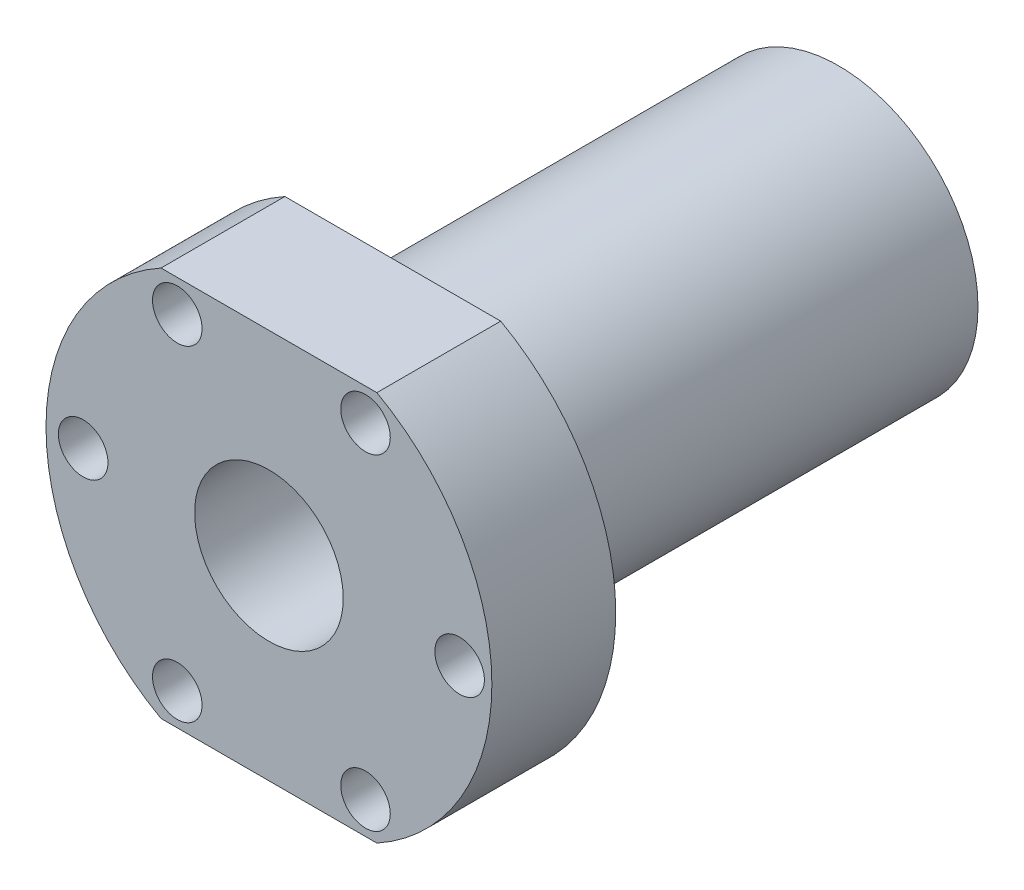
ISO-10303-21;
HEADER;
FILE_DESCRIPTION(('STEP AP214'),'2;1');
FILE_NAME('part.step','',(''),(''),'','','');
FILE_SCHEMA(('AUTOMOTIVE_DESIGN { 1 0 10303 214 1 1 1 1 }'));
ENDSEC;
DATA;
#1=APPLICATION_CONTEXT('core data for automotive mechanical design processes');
#2=APPLICATION_PROTOCOL_DEFINITION('international standard','automotive_design',2000,#1);
#3=PRODUCT_CONTEXT('',#1,'mechanical');
#4=PRODUCT('Part','Part','',(#3));
#5=PRODUCT_RELATED_PRODUCT_CATEGORY('part','',(#4));
#6=PRODUCT_DEFINITION_FORMATION('','',#4);
#7=PRODUCT_DEFINITION_CONTEXT('part definition',#1,'design');
#8=PRODUCT_DEFINITION('design','',#6,#7);
#9=PRODUCT_DEFINITION_SHAPE('','',#8);
#10=(LENGTH_UNIT() NAMED_UNIT(*) SI_UNIT(.MILLI.,.METRE.));
#11=(NAMED_UNIT(*) PLANE_ANGLE_UNIT() SI_UNIT($,.RADIAN.));
#12=(NAMED_UNIT(*) SI_UNIT($,.STERADIAN.) SOLID_ANGLE_UNIT());
#13=UNCERTAINTY_MEASURE_WITH_UNIT(LENGTH_MEASURE(1.E-05),#10,'distance_accuracy_value','');
#14=(GEOMETRIC_REPRESENTATION_CONTEXT(3) GLOBAL_UNCERTAINTY_ASSIGNED_CONTEXT((#13)) GLOBAL_UNIT_ASSIGNED_CONTEXT((#10,
#11,#12)) REPRESENTATION_CONTEXT('',''));
#15=CARTESIAN_POINT('',(0.,0.,0.));
#16=DIRECTION('',(0.,0.,1.));
#17=DIRECTION('',(1.,0.,0.));
#18=AXIS2_PLACEMENT_3D('',#15,#16,#17);
#19=CARTESIAN_POINT('',(0.,0.,10.));
#20=DIRECTION('',(0.,0.,-1.));
#21=DIRECTION('',(-1.,0.,0.));
#22=AXIS2_PLACEMENT_3D('',#19,#20,#21);
#23=CYLINDRICAL_SURFACE('',#22,18.);
#24=CARTESIAN_POINT('',(0.,0.,0.));
#25=DIRECTION('',(0.,0.,1.));
#26=DIRECTION('',(1.,0.,0.));
#27=AXIS2_PLACEMENT_3D('',#24,#25,#26);
#28=CIRCLE('',#27,18.);
#29=CARTESIAN_POINT('',(-8.71421252896669,15.75,0.));
#30=VERTEX_POINT('',#29);
#31=CARTESIAN_POINT('',(-8.71421252896668,-15.75,0.));
#32=VERTEX_POINT('',#31);
#33=EDGE_CURVE('E115',#30,#32,#28,.T.);
#34=ORIENTED_EDGE('',*,*,#33,.T.);
#35=DIRECTION('',(0.,0.,-1.));
#36=VECTOR('',#35,1.);
#37=CARTESIAN_POINT('',(-8.71421252896668,-15.75,10.));
#38=LINE('',#37,#36);
#39=CARTESIAN_POINT('',(-8.71421252896668,-15.75,10.));
#40=VERTEX_POINT('',#39);
#41=EDGE_CURVE('E53',#40,#32,#38,.T.);
#42=ORIENTED_EDGE('',*,*,#41,.F.);
#43=CARTESIAN_POINT('',(0.,0.,10.));
#44=DIRECTION('',(0.,0.,1.));
#45=DIRECTION('',(1.,0.,0.));
#46=AXIS2_PLACEMENT_3D('',#43,#44,#45);
#47=CIRCLE('',#46,18.);
#48=CARTESIAN_POINT('',(-8.71421252896669,15.75,10.));
#49=VERTEX_POINT('',#48);
#50=EDGE_CURVE('E97',#49,#40,#47,.T.);
#51=ORIENTED_EDGE('',*,*,#50,.F.);
#52=DIRECTION('',(0.,0.,-1.));
#53=VECTOR('',#52,1.);
#54=CARTESIAN_POINT('',(-8.71421252896669,15.75,10.));
#55=LINE('',#54,#53);
#56=EDGE_CURVE('E111',#49,#30,#55,.T.);
#57=ORIENTED_EDGE('',*,*,#56,.T.);
#58=EDGE_LOOP('',(#34,#42,#51,#57));
#59=FACE_BOUND('',#58,.T.);
#60=ADVANCED_FACE('F43',(#59),#23,.T.);
#61=CARTESIAN_POINT('',(-8.71421252896668,-15.75,10.));
#62=DIRECTION('',(0.,1.,0.));
#63=DIRECTION('',(0.,0.,1.));
#64=AXIS2_PLACEMENT_3D('',#61,#62,#63);
#65=PLANE('',#64);
#66=DIRECTION('',(1.,0.,0.));
#67=VECTOR('',#66,1.);
#68=CARTESIAN_POINT('',(-8.71421252896668,-15.75,0.));
#69=LINE('',#68,#67);
#70=CARTESIAN_POINT('',(8.71421252896668,-15.75,0.));
#71=VERTEX_POINT('',#70);
#72=EDGE_CURVE('E103',#32,#71,#69,.T.);
#73=ORIENTED_EDGE('',*,*,#72,.T.);
#74=DIRECTION('',(0.,0.,-1.));
#75=VECTOR('',#74,1.);
#76=CARTESIAN_POINT('',(8.71421252896668,-15.75,10.));
#77=LINE('',#76,#75);
#78=CARTESIAN_POINT('',(8.71421252896668,-15.75,10.));
#79=VERTEX_POINT('',#78);
#80=EDGE_CURVE('E101',#79,#71,#77,.T.);
#81=ORIENTED_EDGE('',*,*,#80,.F.);
#82=DIRECTION('',(1.,0.,0.));
#83=VECTOR('',#82,1.);
#84=CARTESIAN_POINT('',(-8.71421252896668,-15.75,10.));
#85=LINE('',#84,#83);
#86=EDGE_CURVE('E92',#40,#79,#85,.T.);
#87=ORIENTED_EDGE('',*,*,#86,.F.);
#88=ORIENTED_EDGE('',*,*,#41,.T.);
#89=EDGE_LOOP('',(#73,#81,#87,#88));
#90=FACE_BOUND('',#89,.T.);
#91=ADVANCED_FACE('F102',(#90),#65,.F.);
#92=CARTESIAN_POINT('',(0.,0.,10.));
#93=DIRECTION('',(0.,0.,-1.));
#94=DIRECTION('',(-1.,0.,0.));
#95=AXIS2_PLACEMENT_3D('',#92,#93,#94);
#96=CYLINDRICAL_SURFACE('',#95,18.);
#97=CARTESIAN_POINT('',(0.,0.,0.));
#98=DIRECTION('',(0.,0.,1.));
#99=DIRECTION('',(1.,0.,0.));
#100=AXIS2_PLACEMENT_3D('',#97,#98,#99);
#101=CIRCLE('',#100,18.);
#102=CARTESIAN_POINT('',(8.7142125289667,15.75,0.));
#103=VERTEX_POINT('',#102);
#104=EDGE_CURVE('E78',#71,#103,#101,.T.);
#105=ORIENTED_EDGE('',*,*,#104,.T.);
#106=DIRECTION('',(0.,0.,-1.));
#107=VECTOR('',#106,1.);
#108=CARTESIAN_POINT('',(8.7142125289667,15.75,10.));
#109=LINE('',#108,#107);
#110=CARTESIAN_POINT('',(8.7142125289667,15.75,10.));
#111=VERTEX_POINT('',#110);
#112=EDGE_CURVE('E105',#111,#103,#109,.T.);
#113=ORIENTED_EDGE('',*,*,#112,.F.);
#114=CARTESIAN_POINT('',(0.,0.,10.));
#115=DIRECTION('',(0.,0.,1.));
#116=DIRECTION('',(1.,0.,0.));
#117=AXIS2_PLACEMENT_3D('',#114,#115,#116);
#118=CIRCLE('',#117,18.);
#119=EDGE_CURVE('E95',#79,#111,#118,.T.);
#120=ORIENTED_EDGE('',*,*,#119,.F.);
#121=ORIENTED_EDGE('',*,*,#80,.T.);
#122=EDGE_LOOP('',(#105,#113,#120,#121));
#123=FACE_BOUND('',#122,.T.);
#124=ADVANCED_FACE('F107',(#123),#96,.T.);
#125=CARTESIAN_POINT('',(8.71421252896669,15.75,10.));
#126=DIRECTION('',(0.,-1.,0.));
#127=DIRECTION('',(0.,0.,-1.));
#128=AXIS2_PLACEMENT_3D('',#125,#126,#127);
#129=PLANE('',#128);
#130=DIRECTION('',(-1.,0.,0.));
#131=VECTOR('',#130,1.);
#132=CARTESIAN_POINT('',(8.71421252896669,15.75,0.));
#133=LINE('',#132,#131);
#134=EDGE_CURVE('E84',#103,#30,#133,.T.);
#135=ORIENTED_EDGE('',*,*,#134,.T.);
#136=ORIENTED_EDGE('',*,*,#56,.F.);
#137=DIRECTION('',(-1.,0.,0.));
#138=VECTOR('',#137,1.);
#139=CARTESIAN_POINT('',(8.71421252896669,15.75,10.));
#140=LINE('',#139,#138);
#141=EDGE_CURVE('E61',#111,#49,#140,.T.);
#142=ORIENTED_EDGE('',*,*,#141,.F.);
#143=ORIENTED_EDGE('',*,*,#112,.T.);
#144=EDGE_LOOP('',(#135,#136,#142,#143));
#145=FACE_BOUND('',#144,.T.);
#146=ADVANCED_FACE('F229',(#145),#129,.F.);
#147=CARTESIAN_POINT('',(0.,0.,10.));
#148=DIRECTION('',(0.,0.,1.));
#149=DIRECTION('',(1.,0.,0.));
#150=AXIS2_PLACEMENT_3D('',#147,#148,#149);
#151=PLANE('',#150);
#152=CARTESIAN_POINT('',(0.,0.,10.));
#153=DIRECTION('',(0.,0.,1.));
#154=DIRECTION('',(1.,0.,0.));
#155=AXIS2_PLACEMENT_3D('',#152,#153,#154);
#156=CIRCLE('',#155,6.);
#157=CARTESIAN_POINT('',(6.,0.,10.));
#158=VERTEX_POINT('',#157);
#159=EDGE_CURVE('E188',#158,#158,#156,.T.);
#160=ORIENTED_EDGE('',*,*,#159,.F.);
#161=EDGE_LOOP('',(#160));
#162=FACE_BOUND('',#161,.T.);
#163=CARTESIAN_POINT('',(-7.40103492470428,13.1617935953538,10.));
#164=DIRECTION('',(0.,0.,1.));
#165=DIRECTION('',(0.50000000000001,-0.866025403784433,0.));
#166=AXIS2_PLACEMENT_3D('',#163,#164,#165);
#167=CIRCLE('',#166,2.);
#168=CARTESIAN_POINT('',(-6.40103492470426,11.4297427877849,10.));
#169=VERTEX_POINT('',#168);
#170=EDGE_CURVE('E169',#169,#169,#167,.T.);
#171=ORIENTED_EDGE('',*,*,#170,.F.);
#172=EDGE_LOOP('',(#171));
#173=FACE_BOUND('',#172,.T.);
#174=CARTESIAN_POINT('',(7.79689522588749,13.161793595354,10.));
#175=DIRECTION('',(0.,0.,1.));
#176=DIRECTION('',(-0.499999999999992,-0.866025403784443,0.));
#177=AXIS2_PLACEMENT_3D('',#174,#175,#176);
#178=CIRCLE('',#177,2.);
#179=CARTESIAN_POINT('',(6.7968952258875,11.4297427877851,10.));
#180=VERTEX_POINT('',#179);
#181=EDGE_CURVE('E173',#180,#180,#178,.T.);
#182=ORIENTED_EDGE('',*,*,#181,.F.);
#183=EDGE_LOOP('',(#182));
#184=FACE_BOUND('',#183,.T.);
#185=CARTESIAN_POINT('',(15.3958603011835,0.,10.));
#186=DIRECTION('',(0.,0.,1.));
#187=DIRECTION('',(-1.,0.,0.));
#188=AXIS2_PLACEMENT_3D('',#185,#186,#187);
#189=CIRCLE('',#188,2.);
#190=CARTESIAN_POINT('',(13.3958603011835,0.,10.));
#191=VERTEX_POINT('',#190);
#192=EDGE_CURVE('E178',#191,#191,#189,.T.);
#193=ORIENTED_EDGE('',*,*,#192,.F.);
#194=EDGE_LOOP('',(#193));
#195=FACE_BOUND('',#194,.T.);
#196=CARTESIAN_POINT('',(7.79689522588767,-13.1617935953539,10.));
#197=DIRECTION('',(0.,0.,1.));
#198=DIRECTION('',(-0.500000000000004,0.866025403784436,0.));
#199=AXIS2_PLACEMENT_3D('',#196,#197,#198);
#200=CIRCLE('',#199,2.);
#201=CARTESIAN_POINT('',(6.79689522588766,-11.429742787785,10.));
#202=VERTEX_POINT('',#201);
#203=EDGE_CURVE('E168',#202,#202,#200,.T.);
#204=ORIENTED_EDGE('',*,*,#203,.F.);
#205=EDGE_LOOP('',(#204));
#206=FACE_BOUND('',#205,.T.);
#207=CARTESIAN_POINT('',(-7.4010349247041,-13.1617935953539,10.));
#208=DIRECTION('',(0.,0.,1.));
#209=DIRECTION('',(0.499999999999998,0.86602540378444,0.));
#210=AXIS2_PLACEMENT_3D('',#207,#208,#209);
#211=CIRCLE('',#210,2.);
#212=CARTESIAN_POINT('',(-6.40103492470411,-11.429742787785,10.));
#213=VERTEX_POINT('',#212);
#214=EDGE_CURVE('E141',#213,#213,#211,.T.);
#215=ORIENTED_EDGE('',*,*,#214,.F.);
#216=EDGE_LOOP('',(#215));
#217=FACE_BOUND('',#216,.T.);
#218=CARTESIAN_POINT('',(-15.,0.,10.));
#219=DIRECTION('',(0.,0.,1.));
#220=DIRECTION('',(1.,0.,0.));
#221=AXIS2_PLACEMENT_3D('',#218,#219,#220);
#222=CIRCLE('',#221,2.);
#223=CARTESIAN_POINT('',(-13.,0.,10.));
#224=VERTEX_POINT('',#223);
#225=EDGE_CURVE('E135',#224,#224,#222,.T.);
#226=ORIENTED_EDGE('',*,*,#225,.F.);
#227=EDGE_LOOP('',(#226));
#228=FACE_BOUND('',#227,.T.);
#229=ORIENTED_EDGE('',*,*,#50,.T.);
#230=ORIENTED_EDGE('',*,*,#86,.T.);
#231=ORIENTED_EDGE('',*,*,#119,.T.);
#232=ORIENTED_EDGE('',*,*,#141,.T.);
#233=EDGE_LOOP('',(#229,#230,#231,#232));
#234=FACE_BOUND('',#233,.T.);
#235=ADVANCED_FACE('F93',(#162,#173,#184,#195,#206,#217,#228,#234),#151,.T.);
#236=CARTESIAN_POINT('',(0.,0.,0.));
#237=DIRECTION('',(0.,0.,1.));
#238=DIRECTION('',(1.,0.,0.));
#239=AXIS2_PLACEMENT_3D('',#236,#237,#238);
#240=PLANE('',#239);
#241=CARTESIAN_POINT('',(0.,0.,0.));
#242=DIRECTION('',(0.,0.,1.));
#243=DIRECTION('',(1.,0.,0.));
#244=AXIS2_PLACEMENT_3D('',#241,#242,#243);
#245=CIRCLE('',#244,11.25);
#246=CARTESIAN_POINT('',(11.25,0.,0.));
#247=VERTEX_POINT('',#246);
#248=EDGE_CURVE('E11',#247,#247,#245,.F.);
#249=ORIENTED_EDGE('',*,*,#248,.F.);
#250=EDGE_LOOP('',(#249));
#251=FACE_BOUND('',#250,.T.);
#252=CARTESIAN_POINT('',(-7.40103492470428,13.1617935953538,0.));
#253=DIRECTION('',(0.,0.,1.));
#254=DIRECTION('',(1.,0.,0.));
#255=AXIS2_PLACEMENT_3D('',#252,#253,#254);
#256=CIRCLE('',#255,2.);
#257=CARTESIAN_POINT('',(-5.40103492470428,13.1617935953538,0.));
#258=VERTEX_POINT('',#257);
#259=EDGE_CURVE('E153',#258,#258,#256,.T.);
#260=ORIENTED_EDGE('',*,*,#259,.T.);
#261=EDGE_LOOP('',(#260));
#262=FACE_BOUND('',#261,.T.);
#263=CARTESIAN_POINT('',(7.79689522588749,13.161793595354,0.));
#264=DIRECTION('',(0.,0.,1.));
#265=DIRECTION('',(1.,0.,0.));
#266=AXIS2_PLACEMENT_3D('',#263,#264,#265);
#267=CIRCLE('',#266,2.);
#268=CARTESIAN_POINT('',(9.79689522588749,13.161793595354,0.));
#269=VERTEX_POINT('',#268);
#270=EDGE_CURVE('E149',#269,#269,#267,.T.);
#271=ORIENTED_EDGE('',*,*,#270,.T.);
#272=EDGE_LOOP('',(#271));
#273=FACE_BOUND('',#272,.T.);
#274=CARTESIAN_POINT('',(15.3958603011835,0.,0.));
#275=DIRECTION('',(0.,0.,1.));
#276=DIRECTION('',(1.,0.,0.));
#277=AXIS2_PLACEMENT_3D('',#274,#275,#276);
#278=CIRCLE('',#277,2.);
#279=CARTESIAN_POINT('',(17.3958603011835,0.,0.));
#280=VERTEX_POINT('',#279);
#281=EDGE_CURVE('E145',#280,#280,#278,.T.);
#282=ORIENTED_EDGE('',*,*,#281,.T.);
#283=EDGE_LOOP('',(#282));
#284=FACE_BOUND('',#283,.T.);
#285=CARTESIAN_POINT('',(7.79689522588767,-13.1617935953539,0.));
#286=DIRECTION('',(0.,0.,1.));
#287=DIRECTION('',(1.,0.,0.));
#288=AXIS2_PLACEMENT_3D('',#285,#286,#287);
#289=CIRCLE('',#288,2.);
#290=CARTESIAN_POINT('',(9.79689522588767,-13.1617935953539,0.));
#291=VERTEX_POINT('',#290);
#292=EDGE_CURVE('E140',#291,#291,#289,.T.);
#293=ORIENTED_EDGE('',*,*,#292,.T.);
#294=EDGE_LOOP('',(#293));
#295=FACE_BOUND('',#294,.T.);
#296=CARTESIAN_POINT('',(-7.4010349247041,-13.1617935953539,0.));
#297=DIRECTION('',(0.,0.,1.));
#298=DIRECTION('',(1.,0.,0.));
#299=AXIS2_PLACEMENT_3D('',#296,#297,#298);
#300=CIRCLE('',#299,2.);
#301=CARTESIAN_POINT('',(-5.4010349247041,-13.1617935953539,0.));
#302=VERTEX_POINT('',#301);
#303=EDGE_CURVE('E136',#302,#302,#300,.T.);
#304=ORIENTED_EDGE('',*,*,#303,.T.);
#305=EDGE_LOOP('',(#304));
#306=FACE_BOUND('',#305,.T.);
#307=CARTESIAN_POINT('',(-15.,0.,0.));
#308=DIRECTION('',(0.,0.,1.));
#309=DIRECTION('',(1.,0.,0.));
#310=AXIS2_PLACEMENT_3D('',#307,#308,#309);
#311=CIRCLE('',#310,2.);
#312=CARTESIAN_POINT('',(-13.,0.,0.));
#313=VERTEX_POINT('',#312);
#314=EDGE_CURVE('E119',#313,#313,#311,.T.);
#315=ORIENTED_EDGE('',*,*,#314,.T.);
#316=EDGE_LOOP('',(#315));
#317=FACE_BOUND('',#316,.T.);
#318=ORIENTED_EDGE('',*,*,#33,.F.);
#319=ORIENTED_EDGE('',*,*,#134,.F.);
#320=ORIENTED_EDGE('',*,*,#104,.F.);
#321=ORIENTED_EDGE('',*,*,#72,.F.);
#322=EDGE_LOOP('',(#318,#319,#320,#321));
#323=FACE_BOUND('',#322,.T.);
#324=ADVANCED_FACE('F212',(#251,#262,#273,#284,#295,#306,#317,#323),#240,.F.);
#325=CARTESIAN_POINT('',(-15.,0.,-8.));
#326=DIRECTION('',(0.,0.,1.));
#327=DIRECTION('',(1.,0.,0.));
#328=AXIS2_PLACEMENT_3D('',#325,#326,#327);
#329=CYLINDRICAL_SURFACE('',#328,2.);
#330=ORIENTED_EDGE('',*,*,#225,.T.);
#331=EDGE_LOOP('',(#330));
#332=FACE_BOUND('',#331,.T.);
#333=ORIENTED_EDGE('',*,*,#314,.F.);
#334=EDGE_LOOP('',(#333));
#335=FACE_BOUND('',#334,.T.);
#336=ADVANCED_FACE('F214',(#332,#335),#329,.F.);
#337=CARTESIAN_POINT('',(-7.4010349247041,-13.1617935953539,-8.));
#338=DIRECTION('',(0.,0.,1.));
#339=DIRECTION('',(1.,0.,0.));
#340=AXIS2_PLACEMENT_3D('',#337,#338,#339);
#341=CYLINDRICAL_SURFACE('',#340,2.);
#342=ORIENTED_EDGE('',*,*,#214,.T.);
#343=EDGE_LOOP('',(#342));
#344=FACE_BOUND('',#343,.T.);
#345=ORIENTED_EDGE('',*,*,#303,.F.);
#346=EDGE_LOOP('',(#345));
#347=FACE_BOUND('',#346,.T.);
#348=ADVANCED_FACE('F265',(#344,#347),#341,.F.);
#349=CARTESIAN_POINT('',(7.79689522588767,-13.1617935953539,-8.));
#350=DIRECTION('',(0.,0.,1.));
#351=DIRECTION('',(1.,0.,0.));
#352=AXIS2_PLACEMENT_3D('',#349,#350,#351);
#353=CYLINDRICAL_SURFACE('',#352,2.);
#354=ORIENTED_EDGE('',*,*,#203,.T.);
#355=EDGE_LOOP('',(#354));
#356=FACE_BOUND('',#355,.T.);
#357=ORIENTED_EDGE('',*,*,#292,.F.);
#358=EDGE_LOOP('',(#357));
#359=FACE_BOUND('',#358,.T.);
#360=ADVANCED_FACE('F276',(#356,#359),#353,.F.);
#361=CARTESIAN_POINT('',(15.3958603011835,0.,-8.));
#362=DIRECTION('',(0.,0.,1.));
#363=DIRECTION('',(1.,0.,0.));
#364=AXIS2_PLACEMENT_3D('',#361,#362,#363);
#365=CYLINDRICAL_SURFACE('',#364,2.);
#366=ORIENTED_EDGE('',*,*,#192,.T.);
#367=EDGE_LOOP('',(#366));
#368=FACE_BOUND('',#367,.T.);
#369=ORIENTED_EDGE('',*,*,#281,.F.);
#370=EDGE_LOOP('',(#369));
#371=FACE_BOUND('',#370,.T.);
#372=ADVANCED_FACE('F287',(#368,#371),#365,.F.);
#373=CARTESIAN_POINT('',(7.79689522588749,13.161793595354,-8.));
#374=DIRECTION('',(0.,0.,1.));
#375=DIRECTION('',(1.,0.,0.));
#376=AXIS2_PLACEMENT_3D('',#373,#374,#375);
#377=CYLINDRICAL_SURFACE('',#376,2.);
#378=ORIENTED_EDGE('',*,*,#181,.T.);
#379=EDGE_LOOP('',(#378));
#380=FACE_BOUND('',#379,.T.);
#381=ORIENTED_EDGE('',*,*,#270,.F.);
#382=EDGE_LOOP('',(#381));
#383=FACE_BOUND('',#382,.T.);
#384=ADVANCED_FACE('F298',(#380,#383),#377,.F.);
#385=CARTESIAN_POINT('',(-7.40103492470428,13.1617935953538,-8.));
#386=DIRECTION('',(0.,0.,1.));
#387=DIRECTION('',(1.,0.,0.));
#388=AXIS2_PLACEMENT_3D('',#385,#386,#387);
#389=CYLINDRICAL_SURFACE('',#388,2.);
#390=ORIENTED_EDGE('',*,*,#170,.T.);
#391=EDGE_LOOP('',(#390));
#392=FACE_BOUND('',#391,.T.);
#393=ORIENTED_EDGE('',*,*,#259,.F.);
#394=EDGE_LOOP('',(#393));
#395=FACE_BOUND('',#394,.T.);
#396=ADVANCED_FACE('F208',(#392,#395),#389,.F.);
#397=CARTESIAN_POINT('',(0.,0.,-36.));
#398=DIRECTION('',(0.,0.,1.));
#399=DIRECTION('',(1.,0.,0.));
#400=AXIS2_PLACEMENT_3D('',#397,#398,#399);
#401=CYLINDRICAL_SURFACE('',#400,11.25);
#402=CARTESIAN_POINT('',(0.,0.,-36.));
#403=DIRECTION('',(0.,0.,-1.));
#404=DIRECTION('',(-1.,0.,0.));
#405=AXIS2_PLACEMENT_3D('',#402,#403,#404);
#406=CIRCLE('',#405,11.25);
#407=CARTESIAN_POINT('',(-11.25,0.,-36.));
#408=VERTEX_POINT('',#407);
#409=EDGE_CURVE('E174',#408,#408,#406,.T.);
#410=ORIENTED_EDGE('',*,*,#409,.F.);
#411=EDGE_LOOP('',(#410));
#412=FACE_BOUND('',#411,.T.);
#413=ORIENTED_EDGE('',*,*,#248,.T.);
#414=EDGE_LOOP('',(#413));
#415=FACE_BOUND('',#414,.T.);
#416=ADVANCED_FACE('F202',(#412,#415),#401,.T.);
#417=CARTESIAN_POINT('',(0.,0.,-36.));
#418=DIRECTION('',(0.,0.,-1.));
#419=DIRECTION('',(-1.,0.,0.));
#420=AXIS2_PLACEMENT_3D('',#417,#418,#419);
#421=PLANE('',#420);
#422=CARTESIAN_POINT('',(0.,0.,-36.));
#423=DIRECTION('',(0.,0.,-1.));
#424=DIRECTION('',(-1.,0.,0.));
#425=AXIS2_PLACEMENT_3D('',#422,#423,#424);
#426=CIRCLE('',#425,6.);
#427=CARTESIAN_POINT('',(-6.,0.,-36.));
#428=VERTEX_POINT('',#427);
#429=EDGE_CURVE('E46',#428,#428,#426,.T.);
#430=ORIENTED_EDGE('',*,*,#429,.F.);
#431=EDGE_LOOP('',(#430));
#432=FACE_BOUND('',#431,.T.);
#433=ORIENTED_EDGE('',*,*,#409,.T.);
#434=EDGE_LOOP('',(#433));
#435=FACE_BOUND('',#434,.T.);
#436=ADVANCED_FACE('F199',(#432,#435),#421,.T.);
#437=CARTESIAN_POINT('',(0.,0.,-43.));
#438=DIRECTION('',(0.,0.,1.));
#439=DIRECTION('',(1.,0.,0.));
#440=AXIS2_PLACEMENT_3D('',#437,#438,#439);
#441=CYLINDRICAL_SURFACE('',#440,6.);
#442=ORIENTED_EDGE('',*,*,#429,.T.);
#443=EDGE_LOOP('',(#442));
#444=FACE_BOUND('',#443,.T.);
#445=ORIENTED_EDGE('',*,*,#159,.T.);
#446=EDGE_LOOP('',(#445));
#447=FACE_BOUND('',#446,.T.);
#448=ADVANCED_FACE('F197',(#444,#447),#441,.F.);
#449=CLOSED_SHELL('',(#60,#91,#124,#146,#235,#324,#336,#348,#360,#372,#384,#396,#416,#436,#448));
#450=MANIFOLD_SOLID_BREP('B2',#449);
#451=ADVANCED_BREP_SHAPE_REPRESENTATION('',(#18,#450),#14);
#452=SHAPE_DEFINITION_REPRESENTATION(#9,#451);
ENDSEC;
END-ISO-10303-21;
